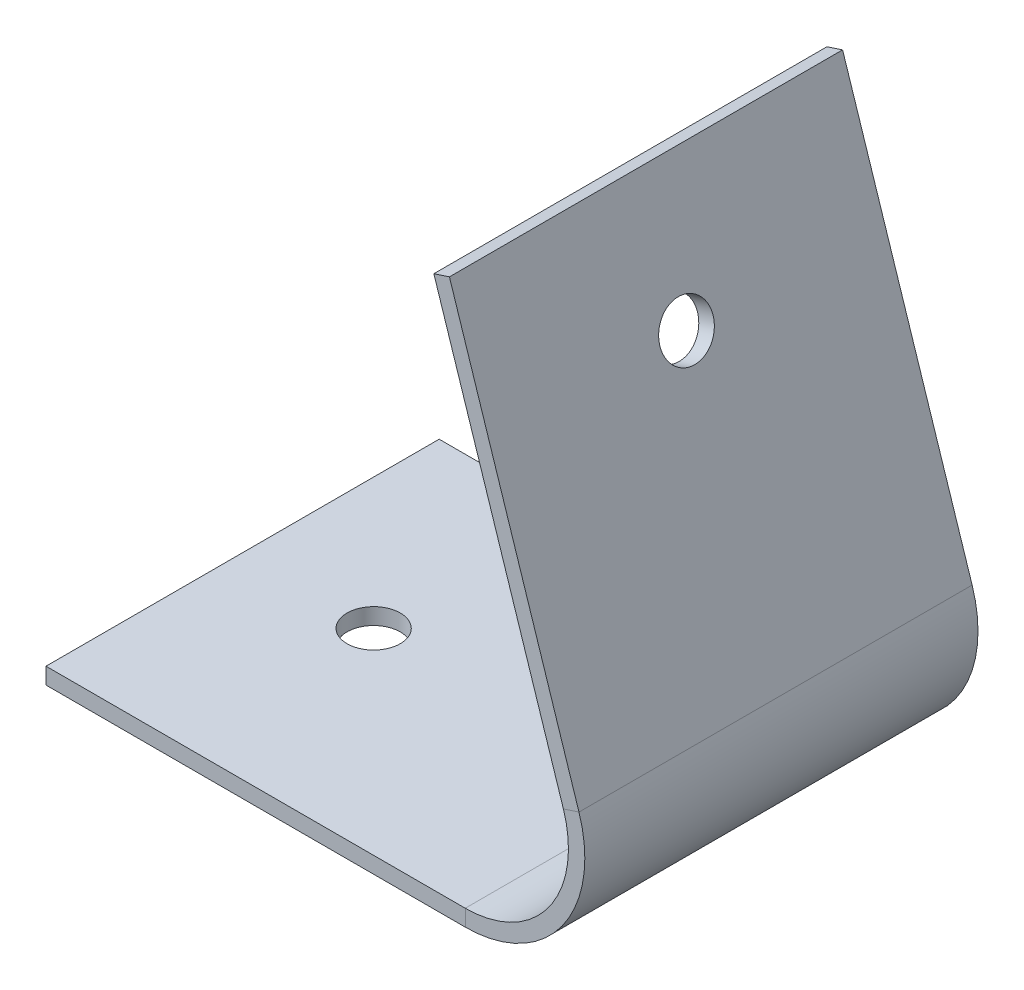
ISO-10303-21;
HEADER;
FILE_DESCRIPTION(('STEP AP214'),'2;1');
FILE_NAME('part.step','',(''),(''),'','','');
FILE_SCHEMA(('AUTOMOTIVE_DESIGN { 1 0 10303 214 1 1 1 1 }'));
ENDSEC;
DATA;
#1=APPLICATION_CONTEXT('core data for automotive mechanical design processes');
#2=APPLICATION_PROTOCOL_DEFINITION('international standard','automotive_design',2000,#1);
#3=PRODUCT_CONTEXT('',#1,'mechanical');
#4=PRODUCT('Part','Part','',(#3));
#5=PRODUCT_RELATED_PRODUCT_CATEGORY('part','',(#4));
#6=PRODUCT_DEFINITION_FORMATION('','',#4);
#7=PRODUCT_DEFINITION_CONTEXT('part definition',#1,'design');
#8=PRODUCT_DEFINITION('design','',#6,#7);
#9=PRODUCT_DEFINITION_SHAPE('','',#8);
#10=(LENGTH_UNIT() NAMED_UNIT(*) SI_UNIT(.MILLI.,.METRE.));
#11=(NAMED_UNIT(*) PLANE_ANGLE_UNIT() SI_UNIT($,.RADIAN.));
#12=(NAMED_UNIT(*) SI_UNIT($,.STERADIAN.) SOLID_ANGLE_UNIT());
#13=UNCERTAINTY_MEASURE_WITH_UNIT(LENGTH_MEASURE(1.E-05),#10,'distance_accuracy_value','');
#14=(GEOMETRIC_REPRESENTATION_CONTEXT(3) GLOBAL_UNCERTAINTY_ASSIGNED_CONTEXT((#13)) GLOBAL_UNIT_ASSIGNED_CONTEXT((#10,
#11,#12)) REPRESENTATION_CONTEXT('',''));
#15=CARTESIAN_POINT('',(0.,0.,0.));
#16=DIRECTION('',(0.,0.,1.));
#17=DIRECTION('',(1.,0.,0.));
#18=AXIS2_PLACEMENT_3D('',#15,#16,#17);
#19=CARTESIAN_POINT('',(2.48128507393255,5.00269591529576,0.));
#20=DIRECTION('',(0.951056516295152,0.309016994374951,0.));
#21=DIRECTION('',(0.,0.,-1.));
#22=AXIS2_PLACEMENT_3D('',#19,#20,#21);
#23=PLANE('',#22);
#24=CARTESIAN_POINT('',(-9.29226241175309,41.2379491861411,0.));
#25=DIRECTION('',(-0.951056516295152,-0.309016994374951,0.));
#26=DIRECTION('',(0.,0.,1.));
#27=AXIS2_PLACEMENT_3D('',#24,#25,#26);
#28=CIRCLE('',#27,2.5796875);
#29=CARTESIAN_POINT('',(-9.29226241175309,41.2379491861411,2.5796875));
#30=VERTEX_POINT('',#29);
#31=EDGE_CURVE('E165',#30,#30,#28,.T.);
#32=ORIENTED_EDGE('',*,*,#31,.F.);
#33=EDGE_LOOP('',(#32));
#34=FACE_BOUND('',#33,.T.);
#35=DIRECTION('',(0.309016994374951,-0.951056516295152,0.));
#36=VECTOR('',#35,1.);
#37=CARTESIAN_POINT('',(18.1793483881801,-43.310975112498,-19.05));
#38=LINE('',#37,#36);
#39=CARTESIAN_POINT('',(-13.216778240315,53.3163669430895,-19.05));
#40=VERTEX_POINT('',#39);
#41=CARTESIAN_POINT('',(-0.662304548453946,14.6776699437495,-19.05));
#42=VERTEX_POINT('',#41);
#43=EDGE_CURVE('E45',#40,#42,#38,.T.);
#44=ORIENTED_EDGE('',*,*,#43,.T.);
#45=DIRECTION('',(0.,0.,1.));
#46=VECTOR('',#45,1.);
#47=CARTESIAN_POINT('',(-0.662304548453946,14.6776699437495,0.));
#48=LINE('',#47,#46);
#49=CARTESIAN_POINT('',(-0.662304548453948,14.6776699437495,19.05));
#50=VERTEX_POINT('',#49);
#51=EDGE_CURVE('E130',#42,#50,#48,.T.);
#52=ORIENTED_EDGE('',*,*,#51,.T.);
#53=DIRECTION('',(-0.309016994374951,0.951056516295152,0.));
#54=VECTOR('',#53,1.);
#55=CARTESIAN_POINT('',(18.1793483881801,-43.310975112498,19.05));
#56=LINE('',#55,#54);
#57=CARTESIAN_POINT('',(-13.216778240315,53.3163669430895,19.05));
#58=VERTEX_POINT('',#57);
#59=EDGE_CURVE('E169',#50,#58,#56,.T.);
#60=ORIENTED_EDGE('',*,*,#59,.T.);
#61=DIRECTION('',(0.,0.,-1.));
#62=VECTOR('',#61,1.);
#63=CARTESIAN_POINT('',(-13.216778240315,53.3163669430895,19.05));
#64=LINE('',#63,#62);
#65=EDGE_CURVE('E161',#58,#40,#64,.T.);
#66=ORIENTED_EDGE('',*,*,#65,.T.);
#67=EDGE_LOOP('',(#44,#52,#60,#66));
#68=FACE_BOUND('',#67,.T.);
#69=ADVANCED_FACE('F41',(#34,#68),#23,.F.);
#70=CARTESIAN_POINT('',(18.1793483881801,-43.310975112498,19.05));
#71=DIRECTION('',(0.,0.,-1.));
#72=DIRECTION('',(-0.309016994374951,0.951056516295152,0.));
#73=AXIS2_PLACEMENT_3D('',#70,#71,#72);
#74=PLANE('',#73);
#75=DIRECTION('',(-0.951056516295152,-0.309016994374951,0.));
#76=VECTOR('',#75,1.);
#77=CARTESIAN_POINT('',(-0.662304548453946,14.6776699437495,19.05));
#78=LINE('',#77,#76);
#79=CARTESIAN_POINT('',(0.847497671164608,15.1682344223198,19.05));
#80=VERTEX_POINT('',#79);
#81=EDGE_CURVE('E12',#80,#50,#78,.T.);
#82=ORIENTED_EDGE('',*,*,#81,.F.);
#83=DIRECTION('',(-0.309016994374951,0.951056516295152,0.));
#84=VECTOR('',#83,1.);
#85=CARTESIAN_POINT('',(3.99108729355111,5.49326039386599,19.05));
#86=LINE('',#85,#84);
#87=CARTESIAN_POINT('',(-11.7069760206964,53.8069314216597,19.05));
#88=VERTEX_POINT('',#87);
#89=EDGE_CURVE('E58',#80,#88,#86,.T.);
#90=ORIENTED_EDGE('',*,*,#89,.T.);
#91=DIRECTION('',(-0.951056516295152,-0.309016994374951,0.));
#92=VECTOR('',#91,1.);
#93=CARTESIAN_POINT('',(-13.216778240315,53.3163669430895,19.05));
#94=LINE('',#93,#92);
#95=EDGE_CURVE('E176',#88,#58,#94,.T.);
#96=ORIENTED_EDGE('',*,*,#95,.T.);
#97=ORIENTED_EDGE('',*,*,#59,.F.);
#98=EDGE_LOOP('',(#82,#90,#96,#97));
#99=FACE_BOUND('',#98,.T.);
#100=ADVANCED_FACE('F43',(#99),#74,.F.);
#101=CARTESIAN_POINT('',(-13.216778240315,53.3163669430895,19.05));
#102=DIRECTION('',(0.309016994374951,-0.951056516295152,0.));
#103=DIRECTION('',(0.,0.,-1.));
#104=AXIS2_PLACEMENT_3D('',#101,#102,#103);
#105=PLANE('',#104);
#106=ORIENTED_EDGE('',*,*,#95,.F.);
#107=DIRECTION('',(0.,0.,-1.));
#108=VECTOR('',#107,1.);
#109=CARTESIAN_POINT('',(-11.7069760206964,53.8069314216597,0.));
#110=LINE('',#109,#108);
#111=CARTESIAN_POINT('',(-11.7069760206964,53.8069314216597,-19.05));
#112=VERTEX_POINT('',#111);
#113=EDGE_CURVE('E170',#88,#112,#110,.T.);
#114=ORIENTED_EDGE('',*,*,#113,.T.);
#115=DIRECTION('',(-0.951056516295152,-0.309016994374951,0.));
#116=VECTOR('',#115,1.);
#117=CARTESIAN_POINT('',(-13.216778240315,53.3163669430895,-19.05));
#118=LINE('',#117,#116);
#119=EDGE_CURVE('E168',#112,#40,#118,.T.);
#120=ORIENTED_EDGE('',*,*,#119,.T.);
#121=ORIENTED_EDGE('',*,*,#65,.F.);
#122=EDGE_LOOP('',(#106,#114,#120,#121));
#123=FACE_BOUND('',#122,.T.);
#124=ADVANCED_FACE('F223',(#123),#105,.F.);
#125=CARTESIAN_POINT('',(18.1793483881801,-43.310975112498,-19.05));
#126=DIRECTION('',(0.,0.,1.));
#127=DIRECTION('',(0.309016994374951,-0.951056516295152,0.));
#128=AXIS2_PLACEMENT_3D('',#125,#126,#127);
#129=PLANE('',#128);
#130=DIRECTION('',(0.951056516295152,0.309016994374951,0.));
#131=VECTOR('',#130,1.);
#132=CARTESIAN_POINT('',(-0.662304548453946,14.6776699437495,-19.05));
#133=LINE('',#132,#131);
#134=CARTESIAN_POINT('',(0.847497671164608,15.1682344223198,-19.05));
#135=VERTEX_POINT('',#134);
#136=EDGE_CURVE('E181',#42,#135,#133,.T.);
#137=ORIENTED_EDGE('',*,*,#136,.F.);
#138=ORIENTED_EDGE('',*,*,#43,.F.);
#139=ORIENTED_EDGE('',*,*,#119,.F.);
#140=DIRECTION('',(-0.309016994374951,0.951056516295152,0.));
#141=VECTOR('',#140,1.);
#142=CARTESIAN_POINT('',(3.99108729355111,5.49326039386599,-19.05));
#143=LINE('',#142,#141);
#144=EDGE_CURVE('E66',#112,#135,#143,.F.);
#145=ORIENTED_EDGE('',*,*,#144,.T.);
#146=EDGE_LOOP('',(#137,#138,#139,#145));
#147=FACE_BOUND('',#146,.T.);
#148=ADVANCED_FACE('F189',(#147),#129,.F.);
#149=CARTESIAN_POINT('',(-9.29226241175309,41.2379491861411,0.));
#150=DIRECTION('',(-0.951056516295152,-0.309016994374951,0.));
#151=DIRECTION('',(0.,0.,1.));
#152=AXIS2_PLACEMENT_3D('',#149,#150,#151);
#153=CYLINDRICAL_SURFACE('',#152,2.5796875);
#154=ORIENTED_EDGE('',*,*,#31,.T.);
#155=EDGE_LOOP('',(#154));
#156=FACE_BOUND('',#155,.T.);
#157=CARTESIAN_POINT('',(-7.78246019213454,41.7285136647113,0.));
#158=DIRECTION('',(-0.951056516295152,-0.309016994374951,0.));
#159=DIRECTION('',(0.,0.,1.));
#160=AXIS2_PLACEMENT_3D('',#157,#158,#159);
#161=CIRCLE('',#160,2.5796875);
#162=CARTESIAN_POINT('',(-7.78246019213454,41.7285136647113,2.5796875));
#163=VERTEX_POINT('',#162);
#164=EDGE_CURVE('E164',#163,#163,#161,.T.);
#165=ORIENTED_EDGE('',*,*,#164,.F.);
#166=EDGE_LOOP('',(#165));
#167=FACE_BOUND('',#166,.T.);
#168=ADVANCED_FACE('F228',(#156,#167),#153,.F.);
#169=CARTESIAN_POINT('',(3.99108729355111,5.49326039386599,0.));
#170=DIRECTION('',(0.951056516295152,0.309016994374951,0.));
#171=DIRECTION('',(0.,0.,-1.));
#172=AXIS2_PLACEMENT_3D('',#169,#170,#171);
#173=PLANE('',#172);
#174=DIRECTION('',(0.,0.,1.));
#175=VECTOR('',#174,1.);
#176=CARTESIAN_POINT('',(0.847497671164608,15.1682344223198,0.));
#177=LINE('',#176,#175);
#178=EDGE_CURVE('E50',#135,#80,#177,.T.);
#179=ORIENTED_EDGE('',*,*,#178,.F.);
#180=ORIENTED_EDGE('',*,*,#144,.F.);
#181=ORIENTED_EDGE('',*,*,#113,.F.);
#182=ORIENTED_EDGE('',*,*,#89,.F.);
#183=EDGE_LOOP('',(#179,#180,#181,#182));
#184=FACE_BOUND('',#183,.T.);
#185=ORIENTED_EDGE('',*,*,#164,.T.);
#186=EDGE_LOOP('',(#185));
#187=FACE_BOUND('',#186,.T.);
#188=ADVANCED_FACE('F224',(#184,#187),#173,.T.);
#189=CARTESIAN_POINT('',(-38.1,1.5875,0.));
#190=DIRECTION('',(0.,1.,0.));
#191=DIRECTION('',(0.,0.,1.));
#192=AXIS2_PLACEMENT_3D('',#189,#190,#191);
#193=CYLINDRICAL_SURFACE('',#192,2.5796875);
#194=CARTESIAN_POINT('',(-38.1,1.5875,0.));
#195=DIRECTION('',(0.,1.,0.));
#196=DIRECTION('',(0.,0.,1.));
#197=AXIS2_PLACEMENT_3D('',#194,#195,#196);
#198=CIRCLE('',#197,2.5796875);
#199=CARTESIAN_POINT('',(-38.1,1.5875,2.5796875));
#200=VERTEX_POINT('',#199);
#201=EDGE_CURVE('E143',#200,#200,#198,.T.);
#202=ORIENTED_EDGE('',*,*,#201,.T.);
#203=EDGE_LOOP('',(#202));
#204=FACE_BOUND('',#203,.T.);
#205=CARTESIAN_POINT('',(-38.1,0.,0.));
#206=DIRECTION('',(0.,1.,0.));
#207=DIRECTION('',(0.,0.,1.));
#208=AXIS2_PLACEMENT_3D('',#205,#206,#207);
#209=CIRCLE('',#208,2.5796875);
#210=CARTESIAN_POINT('',(-38.1,0.,2.5796875));
#211=VERTEX_POINT('',#210);
#212=EDGE_CURVE('E206',#211,#211,#209,.T.);
#213=ORIENTED_EDGE('',*,*,#212,.F.);
#214=EDGE_LOOP('',(#213));
#215=FACE_BOUND('',#214,.T.);
#216=ADVANCED_FACE('F227',(#204,#215),#193,.F.);
#217=CARTESIAN_POINT('',(-50.8,1.5875,19.05));
#218=DIRECTION('',(1.,0.,0.));
#219=DIRECTION('',(0.,0.,1.));
#220=AXIS2_PLACEMENT_3D('',#217,#218,#219);
#221=PLANE('',#220);
#222=DIRECTION('',(0.,1.,0.));
#223=VECTOR('',#222,1.);
#224=CARTESIAN_POINT('',(-50.8,1.5875,-19.05));
#225=LINE('',#224,#223);
#226=CARTESIAN_POINT('',(-50.8,0.,-19.05));
#227=VERTEX_POINT('',#226);
#228=CARTESIAN_POINT('',(-50.8,1.5875,-19.05));
#229=VERTEX_POINT('',#228);
#230=EDGE_CURVE('E147',#227,#229,#225,.T.);
#231=ORIENTED_EDGE('',*,*,#230,.F.);
#232=DIRECTION('',(0.,0.,-1.));
#233=VECTOR('',#232,1.);
#234=CARTESIAN_POINT('',(-50.8,0.,0.));
#235=LINE('',#234,#233);
#236=CARTESIAN_POINT('',(-50.8,0.,19.05));
#237=VERTEX_POINT('',#236);
#238=EDGE_CURVE('E153',#227,#237,#235,.F.);
#239=ORIENTED_EDGE('',*,*,#238,.T.);
#240=DIRECTION('',(0.,1.,0.));
#241=VECTOR('',#240,1.);
#242=CARTESIAN_POINT('',(-50.8,1.5875,19.05));
#243=LINE('',#242,#241);
#244=CARTESIAN_POINT('',(-50.8,1.5875,19.05));
#245=VERTEX_POINT('',#244);
#246=EDGE_CURVE('E150',#237,#245,#243,.T.);
#247=ORIENTED_EDGE('',*,*,#246,.T.);
#248=DIRECTION('',(0.,0.,1.));
#249=VECTOR('',#248,1.);
#250=CARTESIAN_POINT('',(-50.8,1.5875,19.05));
#251=LINE('',#250,#249);
#252=EDGE_CURVE('E149',#229,#245,#251,.T.);
#253=ORIENTED_EDGE('',*,*,#252,.F.);
#254=EDGE_LOOP('',(#231,#239,#247,#253));
#255=FACE_BOUND('',#254,.T.);
#256=ADVANCED_FACE('F213',(#255),#221,.F.);
#257=CARTESIAN_POINT('',(0.,1.5875,0.));
#258=DIRECTION('',(0.,-1.,0.));
#259=DIRECTION('',(0.,0.,-1.));
#260=AXIS2_PLACEMENT_3D('',#257,#258,#259);
#261=PLANE('',#260);
#262=DIRECTION('',(0.,0.,1.));
#263=VECTOR('',#262,1.);
#264=CARTESIAN_POINT('',(-10.1728697114055,1.5875,0.));
#265=LINE('',#264,#263);
#266=CARTESIAN_POINT('',(-10.1728697114055,1.5875,-19.05));
#267=VERTEX_POINT('',#266);
#268=CARTESIAN_POINT('',(-10.1728697114055,1.5875,19.05));
#269=VERTEX_POINT('',#268);
#270=EDGE_CURVE('E127',#267,#269,#265,.T.);
#271=ORIENTED_EDGE('',*,*,#270,.F.);
#272=DIRECTION('',(-1.,0.,0.));
#273=VECTOR('',#272,1.);
#274=CARTESIAN_POINT('',(-50.8,1.5875,-19.05));
#275=LINE('',#274,#273);
#276=EDGE_CURVE('E139',#267,#229,#275,.T.);
#277=ORIENTED_EDGE('',*,*,#276,.T.);
#278=ORIENTED_EDGE('',*,*,#252,.T.);
#279=DIRECTION('',(1.,0.,0.));
#280=VECTOR('',#279,1.);
#281=CARTESIAN_POINT('',(-50.8,1.5875,19.05));
#282=LINE('',#281,#280);
#283=EDGE_CURVE('E121',#245,#269,#282,.T.);
#284=ORIENTED_EDGE('',*,*,#283,.T.);
#285=EDGE_LOOP('',(#271,#277,#278,#284));
#286=FACE_BOUND('',#285,.T.);
#287=ORIENTED_EDGE('',*,*,#201,.F.);
#288=EDGE_LOOP('',(#287));
#289=FACE_BOUND('',#288,.T.);
#290=ADVANCED_FACE('F136',(#286,#289),#261,.F.);
#291=CARTESIAN_POINT('',(-50.8,1.5875,-19.05));
#292=DIRECTION('',(0.,0.,1.));
#293=DIRECTION('',(-1.,0.,0.));
#294=AXIS2_PLACEMENT_3D('',#291,#292,#293);
#295=PLANE('',#294);
#296=ORIENTED_EDGE('',*,*,#276,.F.);
#297=DIRECTION('',(0.,-1.,0.));
#298=VECTOR('',#297,1.);
#299=CARTESIAN_POINT('',(-10.1728697114055,1.5875,-19.05));
#300=LINE('',#299,#298);
#301=CARTESIAN_POINT('',(-10.1728697114055,0.,-19.05));
#302=VERTEX_POINT('',#301);
#303=EDGE_CURVE('E109',#267,#302,#300,.T.);
#304=ORIENTED_EDGE('',*,*,#303,.T.);
#305=DIRECTION('',(1.,0.,0.));
#306=VECTOR('',#305,1.);
#307=CARTESIAN_POINT('',(0.,0.,-19.05));
#308=LINE('',#307,#306);
#309=EDGE_CURVE('E120',#302,#227,#308,.F.);
#310=ORIENTED_EDGE('',*,*,#309,.T.);
#311=ORIENTED_EDGE('',*,*,#230,.T.);
#312=EDGE_LOOP('',(#296,#304,#310,#311));
#313=FACE_BOUND('',#312,.T.);
#314=ADVANCED_FACE('F145',(#313),#295,.F.);
#315=CARTESIAN_POINT('',(0.,0.,0.));
#316=DIRECTION('',(0.,-1.,0.));
#317=DIRECTION('',(0.,0.,-1.));
#318=AXIS2_PLACEMENT_3D('',#315,#316,#317);
#319=PLANE('',#318);
#320=ORIENTED_EDGE('',*,*,#212,.T.);
#321=EDGE_LOOP('',(#320));
#322=FACE_BOUND('',#321,.T.);
#323=ORIENTED_EDGE('',*,*,#309,.F.);
#324=DIRECTION('',(0.,0.,1.));
#325=VECTOR('',#324,1.);
#326=CARTESIAN_POINT('',(-10.1728697114055,0.,0.));
#327=LINE('',#326,#325);
#328=CARTESIAN_POINT('',(-10.1728697114055,0.,19.05));
#329=VERTEX_POINT('',#328);
#330=EDGE_CURVE('E194',#302,#329,#327,.T.);
#331=ORIENTED_EDGE('',*,*,#330,.T.);
#332=DIRECTION('',(1.,0.,0.));
#333=VECTOR('',#332,1.);
#334=CARTESIAN_POINT('',(0.,0.,19.05));
#335=LINE('',#334,#333);
#336=EDGE_CURVE('E202',#237,#329,#335,.T.);
#337=ORIENTED_EDGE('',*,*,#336,.F.);
#338=ORIENTED_EDGE('',*,*,#238,.F.);
#339=EDGE_LOOP('',(#323,#331,#337,#338));
#340=FACE_BOUND('',#339,.T.);
#341=ADVANCED_FACE('F215',(#322,#340),#319,.T.);
#342=CARTESIAN_POINT('',(-50.8,1.5875,19.05));
#343=DIRECTION('',(0.,0.,-1.));
#344=DIRECTION('',(1.,0.,0.));
#345=AXIS2_PLACEMENT_3D('',#342,#343,#344);
#346=PLANE('',#345);
#347=ORIENTED_EDGE('',*,*,#336,.T.);
#348=DIRECTION('',(0.,1.,0.));
#349=VECTOR('',#348,1.);
#350=CARTESIAN_POINT('',(-10.1728697114055,1.5875,19.05));
#351=LINE('',#350,#349);
#352=EDGE_CURVE('E173',#329,#269,#351,.T.);
#353=ORIENTED_EDGE('',*,*,#352,.T.);
#354=ORIENTED_EDGE('',*,*,#283,.F.);
#355=ORIENTED_EDGE('',*,*,#246,.F.);
#356=EDGE_LOOP('',(#347,#353,#354,#355));
#357=FACE_BOUND('',#356,.T.);
#358=ADVANCED_FACE('F217',(#357),#346,.F.);
#359=CARTESIAN_POINT('',(-10.1728697114055,11.5875,-19.05));
#360=DIRECTION('',(0.,0.,1.));
#361=DIRECTION('',(1.,0.,0.));
#362=AXIS2_PLACEMENT_3D('',#359,#360,#361);
#363=PLANE('',#362);
#364=ORIENTED_EDGE('',*,*,#136,.T.);
#365=CARTESIAN_POINT('',(-10.1728697114055,11.5875,-19.05));
#366=DIRECTION('',(0.,0.,-1.));
#367=DIRECTION('',(-1.,0.,0.));
#368=AXIS2_PLACEMENT_3D('',#365,#366,#367);
#369=CIRCLE('',#368,11.5875);
#370=EDGE_CURVE('E116',#135,#302,#369,.T.);
#371=ORIENTED_EDGE('',*,*,#370,.T.);
#372=ORIENTED_EDGE('',*,*,#303,.F.);
#373=CARTESIAN_POINT('',(-10.1728697114055,11.5875,-19.05));
#374=DIRECTION('',(0.,0.,-1.));
#375=DIRECTION('',(-1.,0.,0.));
#376=AXIS2_PLACEMENT_3D('',#373,#374,#375);
#377=CIRCLE('',#376,10.);
#378=EDGE_CURVE('E113',#42,#267,#377,.T.);
#379=ORIENTED_EDGE('',*,*,#378,.F.);
#380=EDGE_LOOP('',(#364,#371,#372,#379));
#381=FACE_BOUND('',#380,.T.);
#382=ADVANCED_FACE('F112',(#381),#363,.F.);
#383=CARTESIAN_POINT('',(-10.1728697114055,11.5875,19.05));
#384=DIRECTION('',(0.,0.,-1.));
#385=DIRECTION('',(-1.,0.,0.));
#386=AXIS2_PLACEMENT_3D('',#383,#384,#385);
#387=PLANE('',#386);
#388=ORIENTED_EDGE('',*,*,#352,.F.);
#389=CARTESIAN_POINT('',(-10.1728697114055,11.5875,19.05));
#390=DIRECTION('',(0.,0.,-1.));
#391=DIRECTION('',(-1.,0.,0.));
#392=AXIS2_PLACEMENT_3D('',#389,#390,#391);
#393=CIRCLE('',#392,11.5875);
#394=EDGE_CURVE('E132',#329,#80,#393,.F.);
#395=ORIENTED_EDGE('',*,*,#394,.T.);
#396=ORIENTED_EDGE('',*,*,#81,.T.);
#397=CARTESIAN_POINT('',(-10.1728697114055,11.5875,19.05));
#398=DIRECTION('',(0.,0.,1.));
#399=DIRECTION('',(1.,0.,0.));
#400=AXIS2_PLACEMENT_3D('',#397,#398,#399);
#401=CIRCLE('',#400,10.);
#402=EDGE_CURVE('E131',#269,#50,#401,.T.);
#403=ORIENTED_EDGE('',*,*,#402,.F.);
#404=EDGE_LOOP('',(#388,#395,#396,#403));
#405=FACE_BOUND('',#404,.T.);
#406=ADVANCED_FACE('F219',(#405),#387,.F.);
#407=CARTESIAN_POINT('',(-10.1728697114055,11.5875,43.221282592155));
#408=DIRECTION('',(0.,0.,-1.));
#409=DIRECTION('',(-1.,0.,0.));
#410=AXIS2_PLACEMENT_3D('',#407,#408,#409);
#411=CYLINDRICAL_SURFACE('',#410,10.);
#412=ORIENTED_EDGE('',*,*,#402,.T.);
#413=ORIENTED_EDGE('',*,*,#51,.F.);
#414=ORIENTED_EDGE('',*,*,#378,.T.);
#415=ORIENTED_EDGE('',*,*,#270,.T.);
#416=EDGE_LOOP('',(#412,#413,#414,#415));
#417=FACE_BOUND('',#416,.T.);
#418=ADVANCED_FACE('F126',(#417),#411,.F.);
#419=CARTESIAN_POINT('',(-10.1728697114055,11.5875,43.221282592155));
#420=DIRECTION('',(0.,0.,-1.));
#421=DIRECTION('',(-1.,0.,0.));
#422=AXIS2_PLACEMENT_3D('',#419,#420,#421);
#423=CYLINDRICAL_SURFACE('',#422,11.5875);
#424=ORIENTED_EDGE('',*,*,#394,.F.);
#425=ORIENTED_EDGE('',*,*,#330,.F.);
#426=ORIENTED_EDGE('',*,*,#370,.F.);
#427=ORIENTED_EDGE('',*,*,#178,.T.);
#428=EDGE_LOOP('',(#424,#425,#426,#427));
#429=FACE_BOUND('',#428,.T.);
#430=ADVANCED_FACE('F192',(#429),#423,.T.);
#431=CLOSED_SHELL('',(#69,#100,#124,#148,#168,#188,#216,#256,#290,#314,#341,#358,#382,#406,#418,#430));
#432=MANIFOLD_SOLID_BREP('B2',#431);
#433=ADVANCED_BREP_SHAPE_REPRESENTATION('',(#18,#432),#14);
#434=SHAPE_DEFINITION_REPRESENTATION(#9,#433);
ENDSEC;
END-ISO-10303-21;
